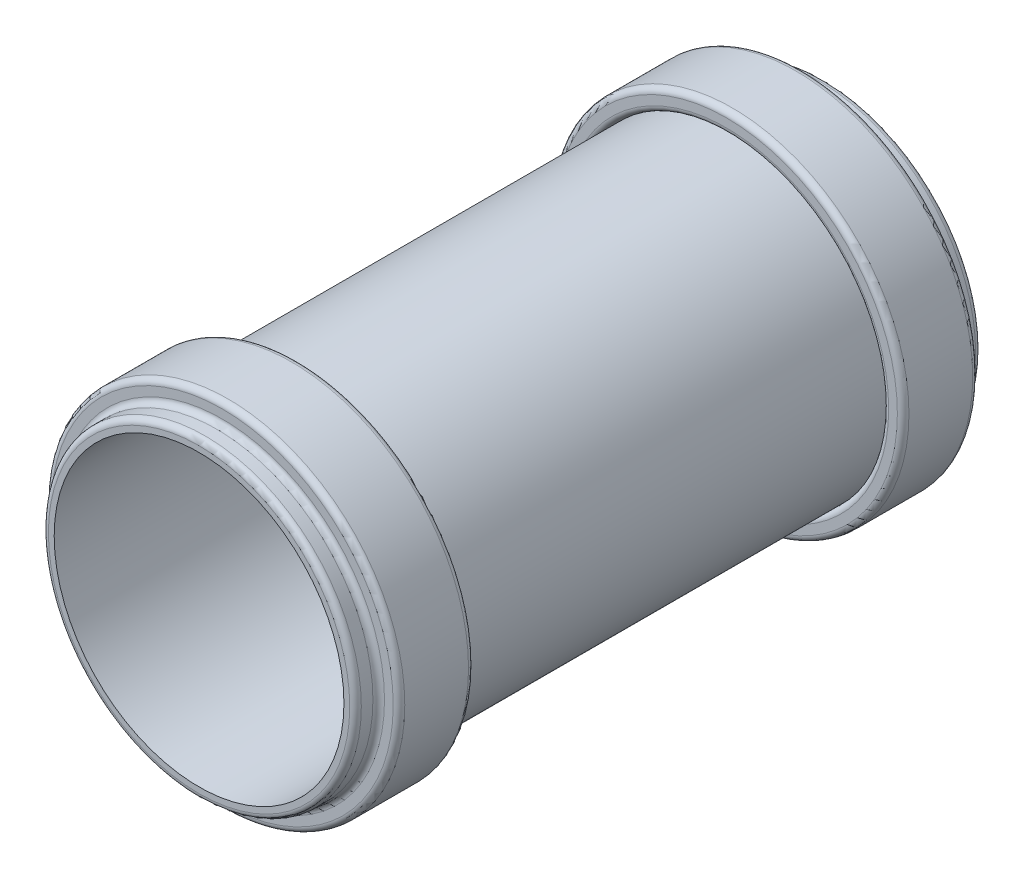
ISO-10303-21;
HEADER;
FILE_DESCRIPTION(('STEP AP214'),'2;1');
FILE_NAME('part.step','',(''),(''),'','','');
FILE_SCHEMA(('AUTOMOTIVE_DESIGN { 1 0 10303 214 1 1 1 1 }'));
ENDSEC;
DATA;
#1=APPLICATION_CONTEXT('core data for automotive mechanical design processes');
#2=APPLICATION_PROTOCOL_DEFINITION('international standard','automotive_design',2000,#1);
#3=PRODUCT_CONTEXT('',#1,'mechanical');
#4=PRODUCT('Part','Part','',(#3));
#5=PRODUCT_RELATED_PRODUCT_CATEGORY('part','',(#4));
#6=PRODUCT_DEFINITION_FORMATION('','',#4);
#7=PRODUCT_DEFINITION_CONTEXT('part definition',#1,'design');
#8=PRODUCT_DEFINITION('design','',#6,#7);
#9=PRODUCT_DEFINITION_SHAPE('','',#8);
#10=(LENGTH_UNIT() NAMED_UNIT(*) SI_UNIT(.MILLI.,.METRE.));
#11=(NAMED_UNIT(*) PLANE_ANGLE_UNIT() SI_UNIT($,.RADIAN.));
#12=(NAMED_UNIT(*) SI_UNIT($,.STERADIAN.) SOLID_ANGLE_UNIT());
#13=UNCERTAINTY_MEASURE_WITH_UNIT(LENGTH_MEASURE(1.E-05),#10,'distance_accuracy_value','');
#14=(GEOMETRIC_REPRESENTATION_CONTEXT(3) GLOBAL_UNCERTAINTY_ASSIGNED_CONTEXT((#13)) GLOBAL_UNIT_ASSIGNED_CONTEXT((#10,
#11,#12)) REPRESENTATION_CONTEXT('',''));
#15=CARTESIAN_POINT('',(0.,0.,0.));
#16=DIRECTION('',(0.,0.,1.));
#17=DIRECTION('',(1.,0.,0.));
#18=AXIS2_PLACEMENT_3D('',#15,#16,#17);
#19=CARTESIAN_POINT('',(0.,0.,-13.));
#20=DIRECTION('',(0.,0.,-1.));
#21=DIRECTION('',(-1.,0.,0.));
#22=AXIS2_PLACEMENT_3D('',#19,#20,#21);
#23=PLANE('',#22);
#24=CARTESIAN_POINT('',(0.,0.,-13.));
#25=DIRECTION('',(0.,0.,-1.));
#26=DIRECTION('',(-1.,0.,0.));
#27=AXIS2_PLACEMENT_3D('',#24,#25,#26);
#28=CIRCLE('',#27,29.5);
#29=CARTESIAN_POINT('',(-29.5,0.,-13.));
#30=VERTEX_POINT('',#29);
#31=EDGE_CURVE('E70',#30,#30,#28,.T.);
#32=ORIENTED_EDGE('',*,*,#31,.T.);
#33=EDGE_LOOP('',(#32));
#34=FACE_BOUND('',#33,.T.);
#35=CARTESIAN_POINT('',(0.,0.,-13.));
#36=DIRECTION('',(0.,0.,-1.));
#37=DIRECTION('',(-1.,0.,0.));
#38=AXIS2_PLACEMENT_3D('',#35,#36,#37);
#39=CIRCLE('',#38,28.);
#40=CARTESIAN_POINT('',(-28.,0.,-13.));
#41=VERTEX_POINT('',#40);
#42=EDGE_CURVE('E73',#41,#41,#39,.F.);
#43=ORIENTED_EDGE('',*,*,#42,.T.);
#44=EDGE_LOOP('',(#43));
#45=FACE_BOUND('',#44,.T.);
#46=ADVANCED_FACE('F44',(#34,#45),#23,.T.);
#47=CARTESIAN_POINT('',(0.,0.,0.));
#48=DIRECTION('',(0.,0.,-1.));
#49=DIRECTION('',(-1.,0.,0.));
#50=AXIS2_PLACEMENT_3D('',#47,#48,#49);
#51=PLANE('',#50);
#52=CARTESIAN_POINT('',(0.,0.,0.));
#53=DIRECTION('',(0.,0.,-1.));
#54=DIRECTION('',(-1.,0.,0.));
#55=AXIS2_PLACEMENT_3D('',#52,#53,#54);
#56=CIRCLE('',#55,29.5);
#57=CARTESIAN_POINT('',(-29.5,0.,0.));
#58=VERTEX_POINT('',#57);
#59=EDGE_CURVE('E11',#58,#58,#56,.F.);
#60=ORIENTED_EDGE('',*,*,#59,.T.);
#61=EDGE_LOOP('',(#60));
#62=FACE_BOUND('',#61,.T.);
#63=CARTESIAN_POINT('',(0.,0.,0.));
#64=DIRECTION('',(0.,0.,-1.));
#65=DIRECTION('',(-1.,0.,0.));
#66=AXIS2_PLACEMENT_3D('',#63,#64,#65);
#67=CIRCLE('',#66,28.);
#68=CARTESIAN_POINT('',(-28.,0.,0.));
#69=VERTEX_POINT('',#68);
#70=EDGE_CURVE('E51',#69,#69,#67,.T.);
#71=ORIENTED_EDGE('',*,*,#70,.T.);
#72=EDGE_LOOP('',(#71));
#73=FACE_BOUND('',#72,.T.);
#74=ADVANCED_FACE('F100',(#62,#73),#51,.F.);
#75=CARTESIAN_POINT('',(0.,0.,-13.));
#76=DIRECTION('',(0.,0.,1.));
#77=DIRECTION('',(1.,0.,0.));
#78=AXIS2_PLACEMENT_3D('',#75,#76,#77);
#79=CYLINDRICAL_SURFACE('',#78,30.5);
#80=CARTESIAN_POINT('',(0.,0.,-12.));
#81=DIRECTION('',(0.,0.,-1.));
#82=DIRECTION('',(-1.,0.,0.));
#83=AXIS2_PLACEMENT_3D('',#80,#81,#82);
#84=CIRCLE('',#83,30.5);
#85=CARTESIAN_POINT('',(30.5,0.,-12.));
#86=VERTEX_POINT('',#85);
#87=EDGE_CURVE('E64',#86,#86,#84,.F.);
#88=CARTESIAN_POINT('',(0.,0.,-0.999999999999999));
#89=DIRECTION('',(0.,0.,-1.));
#90=DIRECTION('',(-1.,0.,0.));
#91=AXIS2_PLACEMENT_3D('',#88,#89,#90);
#92=CIRCLE('',#91,30.5);
#93=CARTESIAN_POINT('',(30.5,0.,-0.999999999999997));
#94=VERTEX_POINT('',#93);
#95=EDGE_CURVE('E67',#94,#94,#92,.T.);
#96=CARTESIAN_POINT('',(30.5,0.,-12.));
#97=CARTESIAN_POINT('',(30.5,0.,-11.8854166666667));
#98=CARTESIAN_POINT('',(30.5,0.,-11.7708333333333));
#99=CARTESIAN_POINT('',(30.5,0.,-11.5416666666667));
#100=CARTESIAN_POINT('',(30.5,0.,-11.4270833333333));
#101=CARTESIAN_POINT('',(30.5,0.,-11.1979166666667));
#102=CARTESIAN_POINT('',(30.5,0.,-11.0833333333333));
#103=CARTESIAN_POINT('',(30.5,0.,-10.8541666666667));
#104=CARTESIAN_POINT('',(30.5,0.,-10.7395833333333));
#105=CARTESIAN_POINT('',(30.5,0.,-10.5104166666667));
#106=CARTESIAN_POINT('',(30.5,0.,-10.3958333333333));
#107=CARTESIAN_POINT('',(30.5,0.,-10.1666666666667));
#108=CARTESIAN_POINT('',(30.5,0.,-10.0520833333333));
#109=CARTESIAN_POINT('',(30.5,0.,-9.82291666666667));
#110=CARTESIAN_POINT('',(30.5,0.,-9.70833333333333));
#111=CARTESIAN_POINT('',(30.5,0.,-9.47916666666667));
#112=CARTESIAN_POINT('',(30.5,0.,-9.36458333333333));
#113=CARTESIAN_POINT('',(30.5,0.,-9.13541666666666));
#114=CARTESIAN_POINT('',(30.5,0.,-9.02083333333333));
#115=CARTESIAN_POINT('',(30.5,0.,-8.79166666666666));
#116=CARTESIAN_POINT('',(30.5,0.,-8.67708333333333));
#117=CARTESIAN_POINT('',(30.5,0.,-8.44791666666667));
#118=CARTESIAN_POINT('',(30.5,0.,-8.33333333333333));
#119=CARTESIAN_POINT('',(30.5,0.,-8.10416666666667));
#120=CARTESIAN_POINT('',(30.5,0.,-7.98958333333333));
#121=CARTESIAN_POINT('',(30.5,0.,-7.76041666666667));
#122=CARTESIAN_POINT('',(30.5,0.,-7.64583333333333));
#123=CARTESIAN_POINT('',(30.5,0.,-7.41666666666667));
#124=CARTESIAN_POINT('',(30.5,0.,-7.30208333333333));
#125=CARTESIAN_POINT('',(30.5,0.,-7.07291666666667));
#126=CARTESIAN_POINT('',(30.5,0.,-6.95833333333333));
#127=CARTESIAN_POINT('',(30.5,0.,-6.72916666666666));
#128=CARTESIAN_POINT('',(30.5,0.,-6.61458333333333));
#129=CARTESIAN_POINT('',(30.5,0.,-6.38541666666666));
#130=CARTESIAN_POINT('',(30.5,0.,-6.27083333333333));
#131=CARTESIAN_POINT('',(30.5,0.,-6.04166666666666));
#132=CARTESIAN_POINT('',(30.5,0.,-5.92708333333333));
#133=CARTESIAN_POINT('',(30.5,0.,-5.69791666666666));
#134=CARTESIAN_POINT('',(30.5,0.,-5.58333333333333));
#135=CARTESIAN_POINT('',(30.5,0.,-5.35416666666667));
#136=CARTESIAN_POINT('',(30.5,0.,-5.23958333333333));
#137=CARTESIAN_POINT('',(30.5,0.,-5.01041666666667));
#138=CARTESIAN_POINT('',(30.5,0.,-4.89583333333333));
#139=CARTESIAN_POINT('',(30.5,0.,-4.66666666666667));
#140=CARTESIAN_POINT('',(30.5,0.,-4.55208333333333));
#141=CARTESIAN_POINT('',(30.5,0.,-4.32291666666667));
#142=CARTESIAN_POINT('',(30.5,0.,-4.20833333333333));
#143=CARTESIAN_POINT('',(30.5,0.,-3.97916666666666));
#144=CARTESIAN_POINT('',(30.5,0.,-3.86458333333333));
#145=CARTESIAN_POINT('',(30.5,0.,-3.63541666666666));
#146=CARTESIAN_POINT('',(30.5,0.,-3.52083333333333));
#147=CARTESIAN_POINT('',(30.5,0.,-3.29166666666666));
#148=CARTESIAN_POINT('',(30.5,0.,-3.17708333333333));
#149=CARTESIAN_POINT('',(30.5,0.,-2.94791666666666));
#150=CARTESIAN_POINT('',(30.5,0.,-2.83333333333333));
#151=CARTESIAN_POINT('',(30.5,0.,-2.60416666666666));
#152=CARTESIAN_POINT('',(30.5,0.,-2.48958333333333));
#153=CARTESIAN_POINT('',(30.5,0.,-2.26041666666667));
#154=CARTESIAN_POINT('',(30.5,0.,-2.14583333333333));
#155=CARTESIAN_POINT('',(30.5,0.,-1.91666666666666));
#156=CARTESIAN_POINT('',(30.5,0.,-1.80208333333333));
#157=CARTESIAN_POINT('',(30.5,0.,-1.57291666666666));
#158=CARTESIAN_POINT('',(30.5,0.,-1.45833333333333));
#159=CARTESIAN_POINT('',(30.5,0.,-1.22916666666666));
#160=CARTESIAN_POINT('',(30.5,0.,-1.11458333333333));
#161=CARTESIAN_POINT('',(30.5,0.,-0.999999999999997));
#162=B_SPLINE_CURVE_WITH_KNOTS('',3,(#96,#97,#98,#99,#100,#101,#102,#103,#104,#105,#106,#107,
#108,#109,#110,#111,#112,#113,#114,#115,#116,#117,#118,#119,#120,#121,#122,#123,#124,#125,#126,
#127,#128,#129,#130,#131,#132,#133,#134,#135,#136,#137,#138,#139,#140,#141,#142,#143,#144,#145,
#146,#147,#148,#149,#150,#151,#152,#153,#154,#155,#156,#157,#158,#159,#160,#161),.UNSPECIFIED.,
.F.,.F.,(4,2,2,2,2,2,2,2,2,2,2,2,2,2,2,2,2,2,2,2,2,2,2,2,2,2,2,2,2,2,2,2,4),(0.,
0.343749999999999,0.687499999999999,1.03125,1.375,1.71875,2.0625,2.40625,2.75,3.09375,3.4375,
3.78125,4.125,4.46875,4.8125,5.15625,5.5,5.84375,6.1875,6.53125,6.875,7.21875,7.5625,7.90625,
8.25,8.59375,8.9375,9.28125,9.625,9.96875,10.3125,10.65625,11.),.UNSPECIFIED.);
#163=EDGE_CURVE('BSEAM89',#86,#94,#162,.T.);
#164=ORIENTED_EDGE('',*,*,#87,.T.);
#165=ORIENTED_EDGE('',*,*,#95,.T.);
#166=ORIENTED_EDGE('',*,*,#163,.T.);
#167=ORIENTED_EDGE('',*,*,#163,.F.);
#168=EDGE_LOOP('',(#164,#166,#165,#167));
#169=FACE_BOUND('',#168,.T.);
#170=ADVANCED_FACE('F89',(#169),#79,.T.);
#171=CARTESIAN_POINT('',(0.,0.,-13.));
#172=DIRECTION('',(0.,0.,1.));
#173=DIRECTION('',(1.,0.,0.));
#174=AXIS2_PLACEMENT_3D('',#171,#172,#173);
#175=CYLINDRICAL_SURFACE('',#174,27.);
#176=CARTESIAN_POINT('',(0.,0.,-12.));
#177=DIRECTION('',(0.,0.,-1.));
#178=DIRECTION('',(-1.,0.,0.));
#179=AXIS2_PLACEMENT_3D('',#176,#177,#178);
#180=CIRCLE('',#179,27.);
#181=CARTESIAN_POINT('',(27.,0.,-12.));
#182=VERTEX_POINT('',#181);
#183=EDGE_CURVE('E55',#182,#182,#180,.T.);
#184=CARTESIAN_POINT('',(0.,0.,-0.999999999999999));
#185=DIRECTION('',(0.,0.,-1.));
#186=DIRECTION('',(-1.,0.,0.));
#187=AXIS2_PLACEMENT_3D('',#184,#185,#186);
#188=CIRCLE('',#187,27.);
#189=CARTESIAN_POINT('',(27.,0.,-0.999999999999997));
#190=VERTEX_POINT('',#189);
#191=EDGE_CURVE('E59',#190,#190,#188,.F.);
#192=CARTESIAN_POINT('',(27.,0.,-12.));
#193=CARTESIAN_POINT('',(27.,0.,-11.8854166666667));
#194=CARTESIAN_POINT('',(27.,0.,-11.7708333333333));
#195=CARTESIAN_POINT('',(27.,0.,-11.5416666666667));
#196=CARTESIAN_POINT('',(27.,0.,-11.4270833333333));
#197=CARTESIAN_POINT('',(27.,0.,-11.1979166666667));
#198=CARTESIAN_POINT('',(27.,0.,-11.0833333333333));
#199=CARTESIAN_POINT('',(27.,0.,-10.8541666666667));
#200=CARTESIAN_POINT('',(27.,0.,-10.7395833333333));
#201=CARTESIAN_POINT('',(27.,0.,-10.5104166666667));
#202=CARTESIAN_POINT('',(27.,0.,-10.3958333333333));
#203=CARTESIAN_POINT('',(27.,0.,-10.1666666666667));
#204=CARTESIAN_POINT('',(27.,0.,-10.0520833333333));
#205=CARTESIAN_POINT('',(27.,0.,-9.82291666666667));
#206=CARTESIAN_POINT('',(27.,0.,-9.70833333333333));
#207=CARTESIAN_POINT('',(27.,0.,-9.47916666666667));
#208=CARTESIAN_POINT('',(27.,0.,-9.36458333333333));
#209=CARTESIAN_POINT('',(27.,0.,-9.13541666666666));
#210=CARTESIAN_POINT('',(27.,0.,-9.02083333333333));
#211=CARTESIAN_POINT('',(27.,0.,-8.79166666666666));
#212=CARTESIAN_POINT('',(27.,0.,-8.67708333333333));
#213=CARTESIAN_POINT('',(27.,0.,-8.44791666666667));
#214=CARTESIAN_POINT('',(27.,0.,-8.33333333333333));
#215=CARTESIAN_POINT('',(27.,0.,-8.10416666666667));
#216=CARTESIAN_POINT('',(27.,0.,-7.98958333333333));
#217=CARTESIAN_POINT('',(27.,0.,-7.76041666666667));
#218=CARTESIAN_POINT('',(27.,0.,-7.64583333333333));
#219=CARTESIAN_POINT('',(27.,0.,-7.41666666666667));
#220=CARTESIAN_POINT('',(27.,0.,-7.30208333333333));
#221=CARTESIAN_POINT('',(27.,0.,-7.07291666666667));
#222=CARTESIAN_POINT('',(27.,0.,-6.95833333333333));
#223=CARTESIAN_POINT('',(27.,0.,-6.72916666666666));
#224=CARTESIAN_POINT('',(27.,0.,-6.61458333333333));
#225=CARTESIAN_POINT('',(27.,0.,-6.38541666666666));
#226=CARTESIAN_POINT('',(27.,0.,-6.27083333333333));
#227=CARTESIAN_POINT('',(27.,0.,-6.04166666666666));
#228=CARTESIAN_POINT('',(27.,0.,-5.92708333333333));
#229=CARTESIAN_POINT('',(27.,0.,-5.69791666666666));
#230=CARTESIAN_POINT('',(27.,0.,-5.58333333333333));
#231=CARTESIAN_POINT('',(27.,0.,-5.35416666666667));
#232=CARTESIAN_POINT('',(27.,0.,-5.23958333333333));
#233=CARTESIAN_POINT('',(27.,0.,-5.01041666666667));
#234=CARTESIAN_POINT('',(27.,0.,-4.89583333333333));
#235=CARTESIAN_POINT('',(27.,0.,-4.66666666666667));
#236=CARTESIAN_POINT('',(27.,0.,-4.55208333333333));
#237=CARTESIAN_POINT('',(27.,0.,-4.32291666666667));
#238=CARTESIAN_POINT('',(27.,0.,-4.20833333333333));
#239=CARTESIAN_POINT('',(27.,0.,-3.97916666666666));
#240=CARTESIAN_POINT('',(27.,0.,-3.86458333333333));
#241=CARTESIAN_POINT('',(27.,0.,-3.63541666666666));
#242=CARTESIAN_POINT('',(27.,0.,-3.52083333333333));
#243=CARTESIAN_POINT('',(27.,0.,-3.29166666666666));
#244=CARTESIAN_POINT('',(27.,0.,-3.17708333333333));
#245=CARTESIAN_POINT('',(27.,0.,-2.94791666666666));
#246=CARTESIAN_POINT('',(27.,0.,-2.83333333333333));
#247=CARTESIAN_POINT('',(27.,0.,-2.60416666666666));
#248=CARTESIAN_POINT('',(27.,0.,-2.48958333333333));
#249=CARTESIAN_POINT('',(27.,0.,-2.26041666666667));
#250=CARTESIAN_POINT('',(27.,0.,-2.14583333333333));
#251=CARTESIAN_POINT('',(27.,0.,-1.91666666666666));
#252=CARTESIAN_POINT('',(27.,0.,-1.80208333333333));
#253=CARTESIAN_POINT('',(27.,0.,-1.57291666666666));
#254=CARTESIAN_POINT('',(27.,0.,-1.45833333333333));
#255=CARTESIAN_POINT('',(27.,0.,-1.22916666666666));
#256=CARTESIAN_POINT('',(27.,0.,-1.11458333333333));
#257=CARTESIAN_POINT('',(27.,0.,-0.999999999999997));
#258=B_SPLINE_CURVE_WITH_KNOTS('',3,(#192,#193,#194,#195,#196,#197,#198,#199,#200,#201,#202,
#203,#204,#205,#206,#207,#208,#209,#210,#211,#212,#213,#214,#215,#216,#217,#218,#219,#220,#221,
#222,#223,#224,#225,#226,#227,#228,#229,#230,#231,#232,#233,#234,#235,#236,#237,#238,#239,#240,
#241,#242,#243,#244,#245,#246,#247,#248,#249,#250,#251,#252,#253,#254,#255,#256,#257),
.UNSPECIFIED.,.F.,.F.,(4,2,2,2,2,2,2,2,2,2,2,2,2,2,2,2,2,2,2,2,2,2,2,2,2,2,2,2,2,2,2,2,4),(0.,
0.343749999999999,0.687499999999999,1.03125,1.375,1.71875,2.0625,2.40625,2.75,3.09375,3.4375,
3.78125,4.125,4.46875,4.8125,5.15625,5.5,5.84375,6.1875,6.53125,6.875,7.21875,7.5625,7.90625,
8.25,8.59375,8.9375,9.28125,9.625,9.96875,10.3125,10.65625,11.),.UNSPECIFIED.);
#259=EDGE_CURVE('BSEAM86',#182,#190,#258,.T.);
#260=ORIENTED_EDGE('',*,*,#183,.T.);
#261=ORIENTED_EDGE('',*,*,#191,.T.);
#262=ORIENTED_EDGE('',*,*,#259,.T.);
#263=ORIENTED_EDGE('',*,*,#259,.F.);
#264=EDGE_LOOP('',(#260,#262,#261,#263));
#265=FACE_BOUND('',#264,.T.);
#266=ADVANCED_FACE('F86',(#265),#175,.F.);
#267=CARTESIAN_POINT('',(0.,0.,-12.));
#268=DIRECTION('',(0.,0.,-1.));
#269=DIRECTION('',(-1.,0.,0.));
#270=AXIS2_PLACEMENT_3D('',#267,#268,#269);
#271=TOROIDAL_SURFACE('',#270,29.5,1.);
#272=ORIENTED_EDGE('',*,*,#87,.F.);
#273=EDGE_LOOP('',(#272));
#274=FACE_BOUND('',#273,.T.);
#275=ORIENTED_EDGE('',*,*,#31,.F.);
#276=EDGE_LOOP('',(#275));
#277=FACE_BOUND('',#276,.T.);
#278=ADVANCED_FACE('F82',(#274,#277),#271,.T.);
#279=CARTESIAN_POINT('',(0.,0.,-12.));
#280=DIRECTION('',(0.,0.,-1.));
#281=DIRECTION('',(-1.,0.,0.));
#282=AXIS2_PLACEMENT_3D('',#279,#280,#281);
#283=TOROIDAL_SURFACE('',#282,28.,1.);
#284=ORIENTED_EDGE('',*,*,#42,.F.);
#285=EDGE_LOOP('',(#284));
#286=FACE_BOUND('',#285,.T.);
#287=ORIENTED_EDGE('',*,*,#183,.F.);
#288=EDGE_LOOP('',(#287));
#289=FACE_BOUND('',#288,.T.);
#290=ADVANCED_FACE('F78',(#286,#289),#283,.T.);
#291=CARTESIAN_POINT('',(0.,0.,-0.999999999999999));
#292=DIRECTION('',(0.,0.,-1.));
#293=DIRECTION('',(-1.,0.,0.));
#294=AXIS2_PLACEMENT_3D('',#291,#292,#293);
#295=TOROIDAL_SURFACE('',#294,29.5,1.);
#296=ORIENTED_EDGE('',*,*,#59,.F.);
#297=EDGE_LOOP('',(#296));
#298=FACE_BOUND('',#297,.T.);
#299=ORIENTED_EDGE('',*,*,#95,.F.);
#300=EDGE_LOOP('',(#299));
#301=FACE_BOUND('',#300,.T.);
#302=ADVANCED_FACE('F81',(#298,#301),#295,.T.);
#303=CARTESIAN_POINT('',(0.,0.,-0.999999999999999));
#304=DIRECTION('',(0.,0.,-1.));
#305=DIRECTION('',(-1.,0.,0.));
#306=AXIS2_PLACEMENT_3D('',#303,#304,#305);
#307=TOROIDAL_SURFACE('',#306,28.,1.);
#308=ORIENTED_EDGE('',*,*,#191,.F.);
#309=EDGE_LOOP('',(#308));
#310=FACE_BOUND('',#309,.T.);
#311=ORIENTED_EDGE('',*,*,#70,.F.);
#312=EDGE_LOOP('',(#311));
#313=FACE_BOUND('',#312,.T.);
#314=ADVANCED_FACE('F46',(#310,#313),#307,.T.);
#315=CLOSED_SHELL('',(#46,#74,#170,#266,#278,#290,#302,#314));
#316=MANIFOLD_SOLID_BREP('B2',#315);
#317=CARTESIAN_POINT('',(0.,0.,74.));
#318=DIRECTION('',(0.,0.,-1.));
#319=DIRECTION('',(-1.,0.,0.));
#320=AXIS2_PLACEMENT_3D('',#317,#318,#319);
#321=CYLINDRICAL_SURFACE('',#320,27.);
#322=CARTESIAN_POINT('',(0.,0.,-16.));
#323=DIRECTION('',(0.,0.,1.));
#324=DIRECTION('',(1.,0.,0.));
#325=AXIS2_PLACEMENT_3D('',#322,#323,#324);
#326=CIRCLE('',#325,27.);
#327=CARTESIAN_POINT('',(27.,0.,-16.));
#328=VERTEX_POINT('',#327);
#329=EDGE_CURVE('E188',#328,#328,#326,.T.);
#330=ORIENTED_EDGE('',*,*,#329,.T.);
#331=EDGE_LOOP('',(#330));
#332=FACE_BOUND('',#331,.T.);
#333=CARTESIAN_POINT('',(0.,0.,73.));
#334=DIRECTION('',(0.,0.,1.));
#335=DIRECTION('',(1.,0.,0.));
#336=AXIS2_PLACEMENT_3D('',#333,#334,#335);
#337=CIRCLE('',#336,27.);
#338=CARTESIAN_POINT('',(27.,0.,73.));
#339=VERTEX_POINT('',#338);
#340=EDGE_CURVE('E201',#339,#339,#337,.F.);
#341=ORIENTED_EDGE('',*,*,#340,.T.);
#342=EDGE_LOOP('',(#341));
#343=FACE_BOUND('',#342,.T.);
#344=ADVANCED_FACE('F181',(#332,#343),#321,.T.);
#345=CARTESIAN_POINT('',(0.,0.,91.));
#346=DIRECTION('',(0.,0.,1.));
#347=DIRECTION('',(1.,0.,0.));
#348=AXIS2_PLACEMENT_3D('',#345,#346,#347);
#349=PLANE('',#348);
#350=CARTESIAN_POINT('',(0.,0.,91.));
#351=DIRECTION('',(0.,0.,1.));
#352=DIRECTION('',(1.,0.,0.));
#353=AXIS2_PLACEMENT_3D('',#350,#351,#352);
#354=CIRCLE('',#353,26.);
#355=CARTESIAN_POINT('',(26.,0.,91.));
#356=VERTEX_POINT('',#355);
#357=EDGE_CURVE('E196',#356,#356,#354,.T.);
#358=ORIENTED_EDGE('',*,*,#357,.T.);
#359=EDGE_LOOP('',(#358));
#360=FACE_BOUND('',#359,.T.);
#361=CARTESIAN_POINT('',(0.,0.,91.));
#362=DIRECTION('',(0.,0.,1.));
#363=DIRECTION('',(1.,0.,0.));
#364=AXIS2_PLACEMENT_3D('',#361,#362,#363);
#365=CIRCLE('',#364,25.);
#366=CARTESIAN_POINT('',(25.,0.,91.));
#367=VERTEX_POINT('',#366);
#368=EDGE_CURVE('E228',#367,#367,#365,.T.);
#369=ORIENTED_EDGE('',*,*,#368,.F.);
#370=EDGE_LOOP('',(#369));
#371=FACE_BOUND('',#370,.T.);
#372=ADVANCED_FACE('F234',(#360,#371),#349,.T.);
#373=CARTESIAN_POINT('',(0.,0.,74.));
#374=DIRECTION('',(0.,0.,-1.));
#375=DIRECTION('',(-1.,0.,0.));
#376=AXIS2_PLACEMENT_3D('',#373,#374,#375);
#377=CYLINDRICAL_SURFACE('',#376,25.);
#378=CARTESIAN_POINT('',(0.,0.,-17.));
#379=DIRECTION('',(0.,0.,1.));
#380=DIRECTION('',(1.,0.,0.));
#381=AXIS2_PLACEMENT_3D('',#378,#379,#380);
#382=CIRCLE('',#381,25.);
#383=CARTESIAN_POINT('',(25.,0.,-17.));
#384=VERTEX_POINT('',#383);
#385=EDGE_CURVE('E225',#384,#384,#382,.T.);
#386=ORIENTED_EDGE('',*,*,#385,.F.);
#387=EDGE_LOOP('',(#386));
#388=FACE_BOUND('',#387,.T.);
#389=ORIENTED_EDGE('',*,*,#368,.T.);
#390=EDGE_LOOP('',(#389));
#391=FACE_BOUND('',#390,.T.);
#392=ADVANCED_FACE('F232',(#388,#391),#377,.F.);
#393=CARTESIAN_POINT('',(0.,0.,90.));
#394=DIRECTION('',(0.,0.,1.));
#395=DIRECTION('',(1.,0.,0.));
#396=AXIS2_PLACEMENT_3D('',#393,#394,#395);
#397=CIRCLE('',#396,27.);
#398=CARTESIAN_POINT('',(27.,0.,90.));
#399=VERTEX_POINT('',#398);
#400=EDGE_CURVE('E192',#399,#399,#397,.F.);
#401=ORIENTED_EDGE('',*,*,#400,.T.);
#402=EDGE_LOOP('',(#401));
#403=FACE_BOUND('',#402,.T.);
#404=CARTESIAN_POINT('',(0.,0.,88.));
#405=DIRECTION('',(0.,0.,1.));
#406=DIRECTION('',(1.,0.,0.));
#407=AXIS2_PLACEMENT_3D('',#404,#405,#406);
#408=CIRCLE('',#407,27.);
#409=CARTESIAN_POINT('',(27.,0.,88.));
#410=VERTEX_POINT('',#409);
#411=EDGE_CURVE('E210',#410,#410,#408,.T.);
#412=ORIENTED_EDGE('',*,*,#411,.T.);
#413=EDGE_LOOP('',(#412));
#414=FACE_BOUND('',#413,.T.);
#415=ADVANCED_FACE('F242',(#403,#414),#321,.T.);
#416=CARTESIAN_POINT('',(0.,0.,-17.));
#417=DIRECTION('',(0.,0.,1.));
#418=DIRECTION('',(1.,0.,0.));
#419=AXIS2_PLACEMENT_3D('',#416,#417,#418);
#420=PLANE('',#419);
#421=CARTESIAN_POINT('',(0.,0.,-17.));
#422=DIRECTION('',(0.,0.,1.));
#423=DIRECTION('',(1.,0.,0.));
#424=AXIS2_PLACEMENT_3D('',#421,#422,#423);
#425=CIRCLE('',#424,26.);
#426=CARTESIAN_POINT('',(26.,0.,-17.));
#427=VERTEX_POINT('',#426);
#428=EDGE_CURVE('E43',#427,#427,#425,.F.);
#429=ORIENTED_EDGE('',*,*,#428,.T.);
#430=EDGE_LOOP('',(#429));
#431=FACE_BOUND('',#430,.T.);
#432=ORIENTED_EDGE('',*,*,#385,.T.);
#433=EDGE_LOOP('',(#432));
#434=FACE_BOUND('',#433,.T.);
#435=ADVANCED_FACE('F250',(#431,#434),#420,.F.);
#436=CARTESIAN_POINT('',(0.,0.,87.));
#437=DIRECTION('',(0.,0.,1.));
#438=DIRECTION('',(1.,0.,0.));
#439=AXIS2_PLACEMENT_3D('',#436,#437,#438);
#440=PLANE('',#439);
#441=CARTESIAN_POINT('',(0.,0.,87.));
#442=DIRECTION('',(0.,0.,1.));
#443=DIRECTION('',(1.,0.,0.));
#444=AXIS2_PLACEMENT_3D('',#441,#442,#443);
#445=CIRCLE('',#444,29.5);
#446=CARTESIAN_POINT('',(29.5,0.,87.));
#447=VERTEX_POINT('',#446);
#448=EDGE_CURVE('E219',#447,#447,#445,.T.);
#449=ORIENTED_EDGE('',*,*,#448,.T.);
#450=EDGE_LOOP('',(#449));
#451=FACE_BOUND('',#450,.T.);
#452=CARTESIAN_POINT('',(0.,0.,87.));
#453=DIRECTION('',(0.,0.,1.));
#454=DIRECTION('',(1.,0.,0.));
#455=AXIS2_PLACEMENT_3D('',#452,#453,#454);
#456=CIRCLE('',#455,28.);
#457=CARTESIAN_POINT('',(28.,0.,87.));
#458=VERTEX_POINT('',#457);
#459=EDGE_CURVE('E222',#458,#458,#456,.F.);
#460=ORIENTED_EDGE('',*,*,#459,.T.);
#461=EDGE_LOOP('',(#460));
#462=FACE_BOUND('',#461,.T.);
#463=ADVANCED_FACE('F252',(#451,#462),#440,.T.);
#464=CARTESIAN_POINT('',(0.,0.,74.));
#465=DIRECTION('',(0.,0.,1.));
#466=DIRECTION('',(1.,0.,0.));
#467=AXIS2_PLACEMENT_3D('',#464,#465,#466);
#468=PLANE('',#467);
#469=CARTESIAN_POINT('',(0.,0.,74.));
#470=DIRECTION('',(0.,0.,1.));
#471=DIRECTION('',(1.,0.,0.));
#472=AXIS2_PLACEMENT_3D('',#469,#470,#471);
#473=CIRCLE('',#472,28.);
#474=CARTESIAN_POINT('',(28.,0.,74.));
#475=VERTEX_POINT('',#474);
#476=EDGE_CURVE('E204',#475,#475,#473,.T.);
#477=ORIENTED_EDGE('',*,*,#476,.T.);
#478=EDGE_LOOP('',(#477));
#479=FACE_BOUND('',#478,.T.);
#480=CARTESIAN_POINT('',(0.,0.,74.));
#481=DIRECTION('',(0.,0.,1.));
#482=DIRECTION('',(1.,0.,0.));
#483=AXIS2_PLACEMENT_3D('',#480,#481,#482);
#484=CIRCLE('',#483,29.5);
#485=CARTESIAN_POINT('',(29.5,0.,74.));
#486=VERTEX_POINT('',#485);
#487=EDGE_CURVE('E207',#486,#486,#484,.F.);
#488=ORIENTED_EDGE('',*,*,#487,.T.);
#489=EDGE_LOOP('',(#488));
#490=FACE_BOUND('',#489,.T.);
#491=ADVANCED_FACE('F359',(#479,#490),#468,.F.);
#492=CARTESIAN_POINT('',(0.,0.,87.));
#493=DIRECTION('',(0.,0.,-1.));
#494=DIRECTION('',(-1.,0.,0.));
#495=AXIS2_PLACEMENT_3D('',#492,#493,#494);
#496=CYLINDRICAL_SURFACE('',#495,30.5);
#497=CARTESIAN_POINT('',(0.,0.,86.));
#498=DIRECTION('',(0.,0.,1.));
#499=DIRECTION('',(1.,0.,0.));
#500=AXIS2_PLACEMENT_3D('',#497,#498,#499);
#501=CIRCLE('',#500,30.5);
#502=CARTESIAN_POINT('',(-30.5,0.,86.));
#503=VERTEX_POINT('',#502);
#504=EDGE_CURVE('E213',#503,#503,#501,.F.);
#505=CARTESIAN_POINT('',(0.,0.,75.));
#506=DIRECTION('',(0.,0.,1.));
#507=DIRECTION('',(1.,0.,0.));
#508=AXIS2_PLACEMENT_3D('',#505,#506,#507);
#509=CIRCLE('',#508,30.5);
#510=CARTESIAN_POINT('',(-30.5,0.,75.));
#511=VERTEX_POINT('',#510);
#512=EDGE_CURVE('E216',#511,#511,#509,.T.);
#513=CARTESIAN_POINT('',(-30.5,0.,86.));
#514=CARTESIAN_POINT('',(-30.5,0.,85.8854166666666));
#515=CARTESIAN_POINT('',(-30.5,0.,85.7708333333333));
#516=CARTESIAN_POINT('',(-30.5,0.,85.5416666666667));
#517=CARTESIAN_POINT('',(-30.5,0.,85.4270833333333));
#518=CARTESIAN_POINT('',(-30.5,0.,85.1979166666667));
#519=CARTESIAN_POINT('',(-30.5,0.,85.0833333333333));
#520=CARTESIAN_POINT('',(-30.5,0.,84.8541666666666));
#521=CARTESIAN_POINT('',(-30.5,0.,84.7395833333333));
#522=CARTESIAN_POINT('',(-30.5,0.,84.5104166666667));
#523=CARTESIAN_POINT('',(-30.5,0.,84.3958333333333));
#524=CARTESIAN_POINT('',(-30.5,0.,84.1666666666667));
#525=CARTESIAN_POINT('',(-30.5,0.,84.0520833333333));
#526=CARTESIAN_POINT('',(-30.5,0.,83.8229166666666));
#527=CARTESIAN_POINT('',(-30.5,0.,83.7083333333333));
#528=CARTESIAN_POINT('',(-30.5,0.,83.4791666666666));
#529=CARTESIAN_POINT('',(-30.5,0.,83.3645833333333));
#530=CARTESIAN_POINT('',(-30.5,0.,83.1354166666667));
#531=CARTESIAN_POINT('',(-30.5,0.,83.0208333333333));
#532=CARTESIAN_POINT('',(-30.5,0.,82.7916666666667));
#533=CARTESIAN_POINT('',(-30.5,0.,82.6770833333333));
#534=CARTESIAN_POINT('',(-30.5,0.,82.4479166666666));
#535=CARTESIAN_POINT('',(-30.5,0.,82.3333333333333));
#536=CARTESIAN_POINT('',(-30.5,0.,82.1041666666667));
#537=CARTESIAN_POINT('',(-30.5,0.,81.9895833333333));
#538=CARTESIAN_POINT('',(-30.5,0.,81.7604166666667));
#539=CARTESIAN_POINT('',(-30.5,0.,81.6458333333333));
#540=CARTESIAN_POINT('',(-30.5,0.,81.4166666666667));
#541=CARTESIAN_POINT('',(-30.5,0.,81.3020833333333));
#542=CARTESIAN_POINT('',(-30.5,0.,81.0729166666666));
#543=CARTESIAN_POINT('',(-30.5,0.,80.9583333333333));
#544=CARTESIAN_POINT('',(-30.5,0.,80.7291666666667));
#545=CARTESIAN_POINT('',(-30.5,0.,80.6145833333333));
#546=CARTESIAN_POINT('',(-30.5,0.,80.3854166666667));
#547=CARTESIAN_POINT('',(-30.5,0.,80.2708333333333));
#548=CARTESIAN_POINT('',(-30.5,0.,80.0416666666666));
#549=CARTESIAN_POINT('',(-30.5,0.,79.9270833333333));
#550=CARTESIAN_POINT('',(-30.5,0.,79.6979166666667));
#551=CARTESIAN_POINT('',(-30.5,0.,79.5833333333333));
#552=CARTESIAN_POINT('',(-30.5,0.,79.3541666666667));
#553=CARTESIAN_POINT('',(-30.5,0.,79.2395833333333));
#554=CARTESIAN_POINT('',(-30.5,0.,79.0104166666667));
#555=CARTESIAN_POINT('',(-30.5,0.,78.8958333333333));
#556=CARTESIAN_POINT('',(-30.5,0.,78.6666666666667));
#557=CARTESIAN_POINT('',(-30.5,0.,78.5520833333333));
#558=CARTESIAN_POINT('',(-30.5,0.,78.3229166666667));
#559=CARTESIAN_POINT('',(-30.5,0.,78.2083333333333));
#560=CARTESIAN_POINT('',(-30.5,0.,77.9791666666667));
#561=CARTESIAN_POINT('',(-30.5,0.,77.8645833333333));
#562=CARTESIAN_POINT('',(-30.5,0.,77.6354166666667));
#563=CARTESIAN_POINT('',(-30.5,0.,77.5208333333333));
#564=CARTESIAN_POINT('',(-30.5,0.,77.2916666666667));
#565=CARTESIAN_POINT('',(-30.5,0.,77.1770833333333));
#566=CARTESIAN_POINT('',(-30.5,0.,76.9479166666667));
#567=CARTESIAN_POINT('',(-30.5,0.,76.8333333333333));
#568=CARTESIAN_POINT('',(-30.5,0.,76.6041666666667));
#569=CARTESIAN_POINT('',(-30.5,0.,76.4895833333333));
#570=CARTESIAN_POINT('',(-30.5,0.,76.2604166666667));
#571=CARTESIAN_POINT('',(-30.5,0.,76.1458333333333));
#572=CARTESIAN_POINT('',(-30.5,0.,75.9166666666667));
#573=CARTESIAN_POINT('',(-30.5,0.,75.8020833333333));
#574=CARTESIAN_POINT('',(-30.5,0.,75.5729166666667));
#575=CARTESIAN_POINT('',(-30.5,0.,75.4583333333333));
#576=CARTESIAN_POINT('',(-30.5,0.,75.2291666666667));
#577=CARTESIAN_POINT('',(-30.5,0.,75.1145833333333));
#578=CARTESIAN_POINT('',(-30.5,0.,75.));
#579=B_SPLINE_CURVE_WITH_KNOTS('',3,(#513,#514,#515,#516,#517,#518,#519,#520,#521,#522,#523,
#524,#525,#526,#527,#528,#529,#530,#531,#532,#533,#534,#535,#536,#537,#538,#539,#540,#541,#542,
#543,#544,#545,#546,#547,#548,#549,#550,#551,#552,#553,#554,#555,#556,#557,#558,#559,#560,#561,
#562,#563,#564,#565,#566,#567,#568,#569,#570,#571,#572,#573,#574,#575,#576,#577,#578),
.UNSPECIFIED.,.F.,.F.,(4,2,2,2,2,2,2,2,2,2,2,2,2,2,2,2,2,2,2,2,2,2,2,2,2,2,2,2,2,2,2,2,4),(0.,
0.34374999999999,0.687499999999994,1.03125,1.37499999999999,1.71874999999999,2.06249999999999,
2.40625,2.74999999999999,3.09374999999999,3.4375,3.78124999999999,4.12499999999999,
4.46874999999999,4.8125,5.15624999999999,5.49999999999999,5.84374999999999,6.18749999999998,
6.53124999999999,6.87499999999999,7.21874999999998,7.56249999999999,7.90624999999999,
8.24999999999999,8.59374999999998,8.93749999999999,9.28124999999999,9.62499999999998,
9.96874999999998,10.3125,10.65625,11.),.UNSPECIFIED.);
#580=EDGE_CURVE('BSEAM248',#503,#511,#579,.T.);
#581=ORIENTED_EDGE('',*,*,#504,.T.);
#582=ORIENTED_EDGE('',*,*,#512,.T.);
#583=ORIENTED_EDGE('',*,*,#580,.T.);
#584=ORIENTED_EDGE('',*,*,#580,.F.);
#585=EDGE_LOOP('',(#581,#583,#582,#584));
#586=FACE_BOUND('',#585,.T.);
#587=ADVANCED_FACE('F248',(#586),#496,.T.);
#588=CARTESIAN_POINT('',(0.,0.,86.));
#589=DIRECTION('',(0.,0.,1.));
#590=DIRECTION('',(1.,0.,0.));
#591=AXIS2_PLACEMENT_3D('',#588,#589,#590);
#592=TOROIDAL_SURFACE('',#591,29.5,1.);
#593=ORIENTED_EDGE('',*,*,#504,.F.);
#594=EDGE_LOOP('',(#593));
#595=FACE_BOUND('',#594,.T.);
#596=ORIENTED_EDGE('',*,*,#448,.F.);
#597=EDGE_LOOP('',(#596));
#598=FACE_BOUND('',#597,.T.);
#599=ADVANCED_FACE('F256',(#595,#598),#592,.T.);
#600=CARTESIAN_POINT('',(0.,0.,88.));
#601=DIRECTION('',(0.,0.,1.));
#602=DIRECTION('',(1.,0.,0.));
#603=AXIS2_PLACEMENT_3D('',#600,#601,#602);
#604=TOROIDAL_SURFACE('',#603,28.,1.);
#605=ORIENTED_EDGE('',*,*,#459,.F.);
#606=EDGE_LOOP('',(#605));
#607=FACE_BOUND('',#606,.T.);
#608=ORIENTED_EDGE('',*,*,#411,.F.);
#609=EDGE_LOOP('',(#608));
#610=FACE_BOUND('',#609,.T.);
#611=ADVANCED_FACE('F259',(#607,#610),#604,.F.);
#612=CARTESIAN_POINT('',(0.,0.,73.));
#613=DIRECTION('',(0.,0.,1.));
#614=DIRECTION('',(1.,0.,0.));
#615=AXIS2_PLACEMENT_3D('',#612,#613,#614);
#616=TOROIDAL_SURFACE('',#615,28.,1.);
#617=ORIENTED_EDGE('',*,*,#340,.F.);
#618=EDGE_LOOP('',(#617));
#619=FACE_BOUND('',#618,.T.);
#620=ORIENTED_EDGE('',*,*,#476,.F.);
#621=EDGE_LOOP('',(#620));
#622=FACE_BOUND('',#621,.T.);
#623=ADVANCED_FACE('F263',(#619,#622),#616,.F.);
#624=CARTESIAN_POINT('',(0.,0.,75.));
#625=DIRECTION('',(0.,0.,1.));
#626=DIRECTION('',(1.,0.,0.));
#627=AXIS2_PLACEMENT_3D('',#624,#625,#626);
#628=TOROIDAL_SURFACE('',#627,29.5,1.);
#629=ORIENTED_EDGE('',*,*,#487,.F.);
#630=EDGE_LOOP('',(#629));
#631=FACE_BOUND('',#630,.T.);
#632=ORIENTED_EDGE('',*,*,#512,.F.);
#633=EDGE_LOOP('',(#632));
#634=FACE_BOUND('',#633,.T.);
#635=ADVANCED_FACE('F267',(#631,#634),#628,.T.);
#636=CARTESIAN_POINT('',(0.,0.,90.));
#637=DIRECTION('',(0.,0.,1.));
#638=DIRECTION('',(1.,0.,0.));
#639=AXIS2_PLACEMENT_3D('',#636,#637,#638);
#640=TOROIDAL_SURFACE('',#639,26.,1.);
#641=ORIENTED_EDGE('',*,*,#400,.F.);
#642=EDGE_LOOP('',(#641));
#643=FACE_BOUND('',#642,.T.);
#644=ORIENTED_EDGE('',*,*,#357,.F.);
#645=EDGE_LOOP('',(#644));
#646=FACE_BOUND('',#645,.T.);
#647=ADVANCED_FACE('F270',(#643,#646),#640,.T.);
#648=CARTESIAN_POINT('',(0.,0.,-16.));
#649=DIRECTION('',(0.,0.,1.));
#650=DIRECTION('',(1.,0.,0.));
#651=AXIS2_PLACEMENT_3D('',#648,#649,#650);
#652=TOROIDAL_SURFACE('',#651,26.,1.);
#653=ORIENTED_EDGE('',*,*,#428,.F.);
#654=EDGE_LOOP('',(#653));
#655=FACE_BOUND('',#654,.T.);
#656=ORIENTED_EDGE('',*,*,#329,.F.);
#657=EDGE_LOOP('',(#656));
#658=FACE_BOUND('',#657,.T.);
#659=ADVANCED_FACE('F183',(#655,#658),#652,.T.);
#660=CLOSED_SHELL('',(#344,#372,#392,#415,#435,#463,#491,#587,#599,#611,#623,#635,#647,#659));
#661=MANIFOLD_SOLID_BREP('B6',#660);
#662=ADVANCED_BREP_SHAPE_REPRESENTATION('',(#18,#316,#661),#14);
#663=SHAPE_DEFINITION_REPRESENTATION(#9,#662);
ENDSEC;
END-ISO-10303-21;
